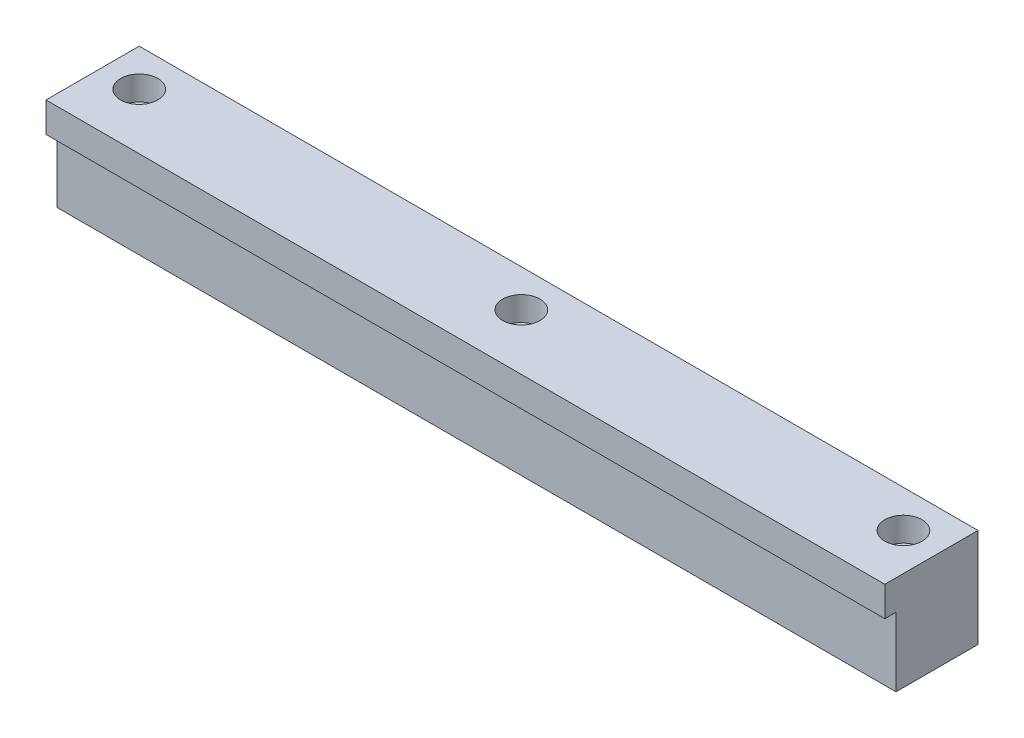
ISO-10303-21;
HEADER;
FILE_DESCRIPTION(('STEP AP214'),'2;1');
FILE_NAME('part.step','',(''),(''),'','','');
FILE_SCHEMA(('AUTOMOTIVE_DESIGN { 1 0 10303 214 1 1 1 1 }'));
ENDSEC;
DATA;
#1=APPLICATION_CONTEXT('core data for automotive mechanical design processes');
#2=APPLICATION_PROTOCOL_DEFINITION('international standard','automotive_design',2000,#1);
#3=PRODUCT_CONTEXT('',#1,'mechanical');
#4=PRODUCT('Part','Part','',(#3));
#5=PRODUCT_RELATED_PRODUCT_CATEGORY('part','',(#4));
#6=PRODUCT_DEFINITION_FORMATION('','',#4);
#7=PRODUCT_DEFINITION_CONTEXT('part definition',#1,'design');
#8=PRODUCT_DEFINITION('design','',#6,#7);
#9=PRODUCT_DEFINITION_SHAPE('','',#8);
#10=(LENGTH_UNIT() NAMED_UNIT(*) SI_UNIT(.MILLI.,.METRE.));
#11=(NAMED_UNIT(*) PLANE_ANGLE_UNIT() SI_UNIT($,.RADIAN.));
#12=(NAMED_UNIT(*) SI_UNIT($,.STERADIAN.) SOLID_ANGLE_UNIT());
#13=UNCERTAINTY_MEASURE_WITH_UNIT(LENGTH_MEASURE(1.E-05),#10,'distance_accuracy_value','');
#14=(GEOMETRIC_REPRESENTATION_CONTEXT(3) GLOBAL_UNCERTAINTY_ASSIGNED_CONTEXT((#13)) GLOBAL_UNIT_ASSIGNED_CONTEXT((#10,
#11,#12)) REPRESENTATION_CONTEXT('',''));
#15=CARTESIAN_POINT('',(0.,0.,0.));
#16=DIRECTION('',(0.,0.,1.));
#17=DIRECTION('',(1.,0.,0.));
#18=AXIS2_PLACEMENT_3D('',#15,#16,#17);
#19=CARTESIAN_POINT('',(205.,-1.2E-05,-5.));
#20=DIRECTION('',(0.,1.,0.));
#21=DIRECTION('',(0.,0.,1.));
#22=AXIS2_PLACEMENT_3D('',#19,#20,#21);
#23=CYLINDRICAL_SURFACE('',#22,7.00000000000001);
#24=CARTESIAN_POINT('',(205.,0.,-5.));
#25=DIRECTION('',(0.,1.,0.));
#26=DIRECTION('',(0.,0.,1.));
#27=AXIS2_PLACEMENT_3D('',#24,#25,#26);
#28=CIRCLE('',#27,7.00000000000001);
#29=CARTESIAN_POINT('',(205.,0.,2.00000000000001));
#30=VERTEX_POINT('',#29);
#31=EDGE_CURVE('E154',#30,#30,#28,.T.);
#32=CARTESIAN_POINT('',(205.,40.,-5.));
#33=DIRECTION('',(0.,1.,0.));
#34=DIRECTION('',(0.,0.,1.));
#35=AXIS2_PLACEMENT_3D('',#32,#33,#34);
#36=CIRCLE('',#35,7.00000000000001);
#37=CARTESIAN_POINT('',(205.,40.,2.00000000000001));
#38=VERTEX_POINT('',#37);
#39=EDGE_CURVE('E43',#38,#38,#36,.F.);
#40=CARTESIAN_POINT('',(205.,0.,2.00000000000001));
#41=CARTESIAN_POINT('',(205.,0.416666666666666,2.00000000000001));
#42=CARTESIAN_POINT('',(205.,0.833333333333333,2.00000000000001));
#43=CARTESIAN_POINT('',(205.,1.66666666666667,2.00000000000001));
#44=CARTESIAN_POINT('',(205.,2.08333333333333,2.00000000000001));
#45=CARTESIAN_POINT('',(205.,2.91666666666667,2.00000000000001));
#46=CARTESIAN_POINT('',(205.,3.33333333333333,2.00000000000001));
#47=CARTESIAN_POINT('',(205.,4.16666666666667,2.00000000000001));
#48=CARTESIAN_POINT('',(205.,4.58333333333333,2.00000000000001));
#49=CARTESIAN_POINT('',(205.,5.41666666666667,2.00000000000001));
#50=CARTESIAN_POINT('',(205.,5.83333333333333,2.00000000000001));
#51=CARTESIAN_POINT('',(205.,6.66666666666667,2.00000000000001));
#52=CARTESIAN_POINT('',(205.,7.08333333333333,2.00000000000001));
#53=CARTESIAN_POINT('',(205.,7.91666666666667,2.00000000000001));
#54=CARTESIAN_POINT('',(205.,8.33333333333333,2.00000000000001));
#55=CARTESIAN_POINT('',(205.,9.16666666666666,2.00000000000001));
#56=CARTESIAN_POINT('',(205.,9.58333333333333,2.00000000000001));
#57=CARTESIAN_POINT('',(205.,10.4166666666667,2.00000000000001));
#58=CARTESIAN_POINT('',(205.,10.8333333333333,2.00000000000001));
#59=CARTESIAN_POINT('',(205.,11.6666666666667,2.00000000000001));
#60=CARTESIAN_POINT('',(205.,12.0833333333333,2.00000000000001));
#61=CARTESIAN_POINT('',(205.,12.9166666666667,2.00000000000001));
#62=CARTESIAN_POINT('',(205.,13.3333333333333,2.00000000000001));
#63=CARTESIAN_POINT('',(205.,14.1666666666667,2.00000000000001));
#64=CARTESIAN_POINT('',(205.,14.5833333333333,2.00000000000001));
#65=CARTESIAN_POINT('',(205.,15.4166666666667,2.00000000000001));
#66=CARTESIAN_POINT('',(205.,15.8333333333333,2.00000000000001));
#67=CARTESIAN_POINT('',(205.,16.6666666666667,2.00000000000001));
#68=CARTESIAN_POINT('',(205.,17.0833333333333,2.00000000000001));
#69=CARTESIAN_POINT('',(205.,17.9166666666667,2.00000000000001));
#70=CARTESIAN_POINT('',(205.,18.3333333333333,2.00000000000001));
#71=CARTESIAN_POINT('',(205.,19.1666666666667,2.00000000000001));
#72=CARTESIAN_POINT('',(205.,19.5833333333333,2.00000000000001));
#73=CARTESIAN_POINT('',(205.,20.4166666666667,2.00000000000001));
#74=CARTESIAN_POINT('',(205.,20.8333333333333,2.00000000000001));
#75=CARTESIAN_POINT('',(205.,21.6666666666667,2.00000000000001));
#76=CARTESIAN_POINT('',(205.,22.0833333333333,2.00000000000001));
#77=CARTESIAN_POINT('',(205.,22.9166666666667,2.00000000000001));
#78=CARTESIAN_POINT('',(205.,23.3333333333333,2.00000000000001));
#79=CARTESIAN_POINT('',(205.,24.1666666666667,2.00000000000001));
#80=CARTESIAN_POINT('',(205.,24.5833333333333,2.00000000000001));
#81=CARTESIAN_POINT('',(205.,25.4166666666667,2.00000000000001));
#82=CARTESIAN_POINT('',(205.,25.8333333333333,2.00000000000001));
#83=CARTESIAN_POINT('',(205.,26.6666666666667,2.00000000000001));
#84=CARTESIAN_POINT('',(205.,27.0833333333333,2.00000000000001));
#85=CARTESIAN_POINT('',(205.,27.9166666666667,2.00000000000001));
#86=CARTESIAN_POINT('',(205.,28.3333333333333,2.00000000000001));
#87=CARTESIAN_POINT('',(205.,29.1666666666667,2.00000000000001));
#88=CARTESIAN_POINT('',(205.,29.5833333333333,2.00000000000001));
#89=CARTESIAN_POINT('',(205.,30.4166666666667,2.00000000000001));
#90=CARTESIAN_POINT('',(205.,30.8333333333333,2.00000000000001));
#91=CARTESIAN_POINT('',(205.,31.6666666666667,2.00000000000001));
#92=CARTESIAN_POINT('',(205.,32.0833333333333,2.00000000000001));
#93=CARTESIAN_POINT('',(205.,32.9166666666667,2.00000000000001));
#94=CARTESIAN_POINT('',(205.,33.3333333333333,2.00000000000001));
#95=CARTESIAN_POINT('',(205.,34.1666666666667,2.00000000000001));
#96=CARTESIAN_POINT('',(205.,34.5833333333333,2.00000000000001));
#97=CARTESIAN_POINT('',(205.,35.4166666666667,2.00000000000001));
#98=CARTESIAN_POINT('',(205.,35.8333333333333,2.00000000000001));
#99=CARTESIAN_POINT('',(205.,36.6666666666667,2.00000000000001));
#100=CARTESIAN_POINT('',(205.,37.0833333333333,2.00000000000001));
#101=CARTESIAN_POINT('',(205.,37.9166666666667,2.00000000000001));
#102=CARTESIAN_POINT('',(205.,38.3333333333333,2.00000000000001));
#103=CARTESIAN_POINT('',(205.,39.1666666666667,2.00000000000001));
#104=CARTESIAN_POINT('',(205.,39.5833333333333,2.00000000000001));
#105=CARTESIAN_POINT('',(205.,40.,2.00000000000001));
#106=B_SPLINE_CURVE_WITH_KNOTS('',3,(#40,#41,#42,#43,#44,#45,#46,#47,#48,#49,#50,#51,#52,#53,
#54,#55,#56,#57,#58,#59,#60,#61,#62,#63,#64,#65,#66,#67,#68,#69,#70,#71,#72,#73,#74,#75,#76,#77,
#78,#79,#80,#81,#82,#83,#84,#85,#86,#87,#88,#89,#90,#91,#92,#93,#94,#95,#96,#97,#98,#99,#100,
#101,#102,#103,#104,#105),.UNSPECIFIED.,.F.,.F.,(4,2,2,2,2,2,2,2,2,2,2,2,2,2,2,2,2,2,2,2,2,2,2,
2,2,2,2,2,2,2,2,2,4),(0.,1.25,2.5,3.75,5.,6.25,7.5,8.75,10.,11.25,12.5,13.75,15.,16.25,17.5,
18.75,20.,21.25,22.5,23.75,25.,26.25,27.5,28.75,30.,31.25,32.5,33.75,35.,36.25,37.5,38.75,40.),.UNSPECIFIED.);
#107=EDGE_CURVE('BSEAM39',#30,#38,#106,.T.);
#108=ORIENTED_EDGE('',*,*,#31,.F.);
#109=ORIENTED_EDGE('',*,*,#39,.F.);
#110=ORIENTED_EDGE('',*,*,#107,.T.);
#111=ORIENTED_EDGE('',*,*,#107,.F.);
#112=EDGE_LOOP('',(#108,#110,#109,#111));
#113=FACE_BOUND('',#112,.T.);
#114=ADVANCED_FACE('F39',(#113),#23,.F.);
#115=CARTESIAN_POINT('',(0.,-1.2E-05,-5.));
#116=DIRECTION('',(0.,1.,0.));
#117=DIRECTION('',(0.,0.,1.));
#118=AXIS2_PLACEMENT_3D('',#115,#116,#117);
#119=CYLINDRICAL_SURFACE('',#118,7.);
#120=CARTESIAN_POINT('',(0.,0.,-5.));
#121=DIRECTION('',(0.,1.,0.));
#122=DIRECTION('',(0.,0.,1.));
#123=AXIS2_PLACEMENT_3D('',#120,#121,#122);
#124=CIRCLE('',#123,7.);
#125=CARTESIAN_POINT('',(0.,0.,2.));
#126=VERTEX_POINT('',#125);
#127=EDGE_CURVE('E116',#126,#126,#124,.T.);
#128=CARTESIAN_POINT('',(0.,40.,-5.));
#129=DIRECTION('',(0.,1.,0.));
#130=DIRECTION('',(0.,0.,1.));
#131=AXIS2_PLACEMENT_3D('',#128,#129,#130);
#132=CIRCLE('',#131,7.);
#133=CARTESIAN_POINT('',(0.,40.,2.));
#134=VERTEX_POINT('',#133);
#135=EDGE_CURVE('E148',#134,#134,#132,.F.);
#136=CARTESIAN_POINT('',(0.,0.,2.));
#137=CARTESIAN_POINT('',(0.,0.416666666666666,2.));
#138=CARTESIAN_POINT('',(0.,0.833333333333333,2.));
#139=CARTESIAN_POINT('',(0.,1.66666666666667,2.));
#140=CARTESIAN_POINT('',(0.,2.08333333333333,2.));
#141=CARTESIAN_POINT('',(0.,2.91666666666667,2.));
#142=CARTESIAN_POINT('',(0.,3.33333333333333,2.));
#143=CARTESIAN_POINT('',(0.,4.16666666666667,2.));
#144=CARTESIAN_POINT('',(0.,4.58333333333333,2.));
#145=CARTESIAN_POINT('',(0.,5.41666666666667,2.));
#146=CARTESIAN_POINT('',(0.,5.83333333333333,2.));
#147=CARTESIAN_POINT('',(0.,6.66666666666667,2.));
#148=CARTESIAN_POINT('',(0.,7.08333333333333,2.));
#149=CARTESIAN_POINT('',(0.,7.91666666666667,2.));
#150=CARTESIAN_POINT('',(0.,8.33333333333333,2.));
#151=CARTESIAN_POINT('',(0.,9.16666666666666,2.));
#152=CARTESIAN_POINT('',(0.,9.58333333333333,2.));
#153=CARTESIAN_POINT('',(0.,10.4166666666667,2.));
#154=CARTESIAN_POINT('',(0.,10.8333333333333,2.));
#155=CARTESIAN_POINT('',(0.,11.6666666666667,2.));
#156=CARTESIAN_POINT('',(0.,12.0833333333333,2.));
#157=CARTESIAN_POINT('',(0.,12.9166666666667,2.));
#158=CARTESIAN_POINT('',(0.,13.3333333333333,2.));
#159=CARTESIAN_POINT('',(0.,14.1666666666667,2.));
#160=CARTESIAN_POINT('',(0.,14.5833333333333,2.));
#161=CARTESIAN_POINT('',(0.,15.4166666666667,2.));
#162=CARTESIAN_POINT('',(0.,15.8333333333333,2.));
#163=CARTESIAN_POINT('',(0.,16.6666666666667,2.));
#164=CARTESIAN_POINT('',(0.,17.0833333333333,2.));
#165=CARTESIAN_POINT('',(0.,17.9166666666667,2.));
#166=CARTESIAN_POINT('',(0.,18.3333333333333,2.));
#167=CARTESIAN_POINT('',(0.,19.1666666666667,2.));
#168=CARTESIAN_POINT('',(0.,19.5833333333333,2.));
#169=CARTESIAN_POINT('',(0.,20.4166666666667,2.));
#170=CARTESIAN_POINT('',(0.,20.8333333333333,2.));
#171=CARTESIAN_POINT('',(0.,21.6666666666667,2.));
#172=CARTESIAN_POINT('',(0.,22.0833333333333,2.));
#173=CARTESIAN_POINT('',(0.,22.9166666666667,2.));
#174=CARTESIAN_POINT('',(0.,23.3333333333333,2.));
#175=CARTESIAN_POINT('',(0.,24.1666666666667,2.));
#176=CARTESIAN_POINT('',(0.,24.5833333333333,2.));
#177=CARTESIAN_POINT('',(0.,25.4166666666667,2.));
#178=CARTESIAN_POINT('',(0.,25.8333333333333,2.));
#179=CARTESIAN_POINT('',(0.,26.6666666666667,2.));
#180=CARTESIAN_POINT('',(0.,27.0833333333333,2.));
#181=CARTESIAN_POINT('',(0.,27.9166666666667,2.));
#182=CARTESIAN_POINT('',(0.,28.3333333333333,2.));
#183=CARTESIAN_POINT('',(0.,29.1666666666667,2.));
#184=CARTESIAN_POINT('',(0.,29.5833333333333,2.));
#185=CARTESIAN_POINT('',(0.,30.4166666666667,2.));
#186=CARTESIAN_POINT('',(0.,30.8333333333333,2.));
#187=CARTESIAN_POINT('',(0.,31.6666666666667,2.));
#188=CARTESIAN_POINT('',(0.,32.0833333333333,2.));
#189=CARTESIAN_POINT('',(0.,32.9166666666667,2.));
#190=CARTESIAN_POINT('',(0.,33.3333333333333,2.));
#191=CARTESIAN_POINT('',(0.,34.1666666666667,2.));
#192=CARTESIAN_POINT('',(0.,34.5833333333333,2.));
#193=CARTESIAN_POINT('',(0.,35.4166666666667,2.));
#194=CARTESIAN_POINT('',(0.,35.8333333333333,2.));
#195=CARTESIAN_POINT('',(0.,36.6666666666667,2.));
#196=CARTESIAN_POINT('',(0.,37.0833333333333,2.));
#197=CARTESIAN_POINT('',(0.,37.9166666666667,2.));
#198=CARTESIAN_POINT('',(0.,38.3333333333333,2.));
#199=CARTESIAN_POINT('',(0.,39.1666666666667,2.));
#200=CARTESIAN_POINT('',(0.,39.5833333333333,2.));
#201=CARTESIAN_POINT('',(0.,40.,2.));
#202=B_SPLINE_CURVE_WITH_KNOTS('',3,(#136,#137,#138,#139,#140,#141,#142,#143,#144,#145,#146,
#147,#148,#149,#150,#151,#152,#153,#154,#155,#156,#157,#158,#159,#160,#161,#162,#163,#164,#165,
#166,#167,#168,#169,#170,#171,#172,#173,#174,#175,#176,#177,#178,#179,#180,#181,#182,#183,#184,
#185,#186,#187,#188,#189,#190,#191,#192,#193,#194,#195,#196,#197,#198,#199,#200,#201),
.UNSPECIFIED.,.F.,.F.,(4,2,2,2,2,2,2,2,2,2,2,2,2,2,2,2,2,2,2,2,2,2,2,2,2,2,2,2,2,2,2,2,4),(0.,
1.25,2.5,3.75,5.,6.25,7.5,8.75,10.,11.25,12.5,13.75,15.,16.25,17.5,18.75,20.,21.25,22.5,23.75,
25.,26.25,27.5,28.75,30.,31.25,32.5,33.75,35.,36.25,37.5,38.75,40.),.UNSPECIFIED.);
#203=EDGE_CURVE('BSEAM205',#126,#134,#202,.T.);
#204=ORIENTED_EDGE('',*,*,#127,.F.);
#205=ORIENTED_EDGE('',*,*,#135,.F.);
#206=ORIENTED_EDGE('',*,*,#203,.T.);
#207=ORIENTED_EDGE('',*,*,#203,.F.);
#208=EDGE_LOOP('',(#204,#206,#205,#207));
#209=FACE_BOUND('',#208,.T.);
#210=ADVANCED_FACE('F205',(#209),#119,.F.);
#211=CARTESIAN_POINT('',(-205.,-1.2E-05,-5.));
#212=DIRECTION('',(0.,1.,0.));
#213=DIRECTION('',(0.,0.,1.));
#214=AXIS2_PLACEMENT_3D('',#211,#212,#213);
#215=CYLINDRICAL_SURFACE('',#214,7.00000000000001);
#216=CARTESIAN_POINT('',(-205.,0.,-5.));
#217=DIRECTION('',(0.,1.,0.));
#218=DIRECTION('',(0.,0.,1.));
#219=AXIS2_PLACEMENT_3D('',#216,#217,#218);
#220=CIRCLE('',#219,7.00000000000001);
#221=CARTESIAN_POINT('',(-205.,0.,2.00000000000001));
#222=VERTEX_POINT('',#221);
#223=EDGE_CURVE('E113',#222,#222,#220,.T.);
#224=CARTESIAN_POINT('',(-205.,40.,-5.));
#225=DIRECTION('',(0.,1.,0.));
#226=DIRECTION('',(0.,0.,1.));
#227=AXIS2_PLACEMENT_3D('',#224,#225,#226);
#228=CIRCLE('',#227,7.00000000000001);
#229=CARTESIAN_POINT('',(-205.,40.,2.00000000000001));
#230=VERTEX_POINT('',#229);
#231=EDGE_CURVE('E146',#230,#230,#228,.F.);
#232=CARTESIAN_POINT('',(-205.,0.,2.00000000000001));
#233=CARTESIAN_POINT('',(-205.,0.416666666666666,2.00000000000001));
#234=CARTESIAN_POINT('',(-205.,0.833333333333333,2.00000000000001));
#235=CARTESIAN_POINT('',(-205.,1.66666666666667,2.00000000000001));
#236=CARTESIAN_POINT('',(-205.,2.08333333333333,2.00000000000001));
#237=CARTESIAN_POINT('',(-205.,2.91666666666667,2.00000000000001));
#238=CARTESIAN_POINT('',(-205.,3.33333333333333,2.00000000000001));
#239=CARTESIAN_POINT('',(-205.,4.16666666666667,2.00000000000001));
#240=CARTESIAN_POINT('',(-205.,4.58333333333333,2.00000000000001));
#241=CARTESIAN_POINT('',(-205.,5.41666666666667,2.00000000000001));
#242=CARTESIAN_POINT('',(-205.,5.83333333333333,2.00000000000001));
#243=CARTESIAN_POINT('',(-205.,6.66666666666667,2.00000000000001));
#244=CARTESIAN_POINT('',(-205.,7.08333333333333,2.00000000000001));
#245=CARTESIAN_POINT('',(-205.,7.91666666666667,2.00000000000001));
#246=CARTESIAN_POINT('',(-205.,8.33333333333333,2.00000000000001));
#247=CARTESIAN_POINT('',(-205.,9.16666666666666,2.00000000000001));
#248=CARTESIAN_POINT('',(-205.,9.58333333333333,2.00000000000001));
#249=CARTESIAN_POINT('',(-205.,10.4166666666667,2.00000000000001));
#250=CARTESIAN_POINT('',(-205.,10.8333333333333,2.00000000000001));
#251=CARTESIAN_POINT('',(-205.,11.6666666666667,2.00000000000001));
#252=CARTESIAN_POINT('',(-205.,12.0833333333333,2.00000000000001));
#253=CARTESIAN_POINT('',(-205.,12.9166666666667,2.00000000000001));
#254=CARTESIAN_POINT('',(-205.,13.3333333333333,2.00000000000001));
#255=CARTESIAN_POINT('',(-205.,14.1666666666667,2.00000000000001));
#256=CARTESIAN_POINT('',(-205.,14.5833333333333,2.00000000000001));
#257=CARTESIAN_POINT('',(-205.,15.4166666666667,2.00000000000001));
#258=CARTESIAN_POINT('',(-205.,15.8333333333333,2.00000000000001));
#259=CARTESIAN_POINT('',(-205.,16.6666666666667,2.00000000000001));
#260=CARTESIAN_POINT('',(-205.,17.0833333333333,2.00000000000001));
#261=CARTESIAN_POINT('',(-205.,17.9166666666667,2.00000000000001));
#262=CARTESIAN_POINT('',(-205.,18.3333333333333,2.00000000000001));
#263=CARTESIAN_POINT('',(-205.,19.1666666666667,2.00000000000001));
#264=CARTESIAN_POINT('',(-205.,19.5833333333333,2.00000000000001));
#265=CARTESIAN_POINT('',(-205.,20.4166666666667,2.00000000000001));
#266=CARTESIAN_POINT('',(-205.,20.8333333333333,2.00000000000001));
#267=CARTESIAN_POINT('',(-205.,21.6666666666667,2.00000000000001));
#268=CARTESIAN_POINT('',(-205.,22.0833333333333,2.00000000000001));
#269=CARTESIAN_POINT('',(-205.,22.9166666666667,2.00000000000001));
#270=CARTESIAN_POINT('',(-205.,23.3333333333333,2.00000000000001));
#271=CARTESIAN_POINT('',(-205.,24.1666666666667,2.00000000000001));
#272=CARTESIAN_POINT('',(-205.,24.5833333333333,2.00000000000001));
#273=CARTESIAN_POINT('',(-205.,25.4166666666667,2.00000000000001));
#274=CARTESIAN_POINT('',(-205.,25.8333333333333,2.00000000000001));
#275=CARTESIAN_POINT('',(-205.,26.6666666666667,2.00000000000001));
#276=CARTESIAN_POINT('',(-205.,27.0833333333333,2.00000000000001));
#277=CARTESIAN_POINT('',(-205.,27.9166666666667,2.00000000000001));
#278=CARTESIAN_POINT('',(-205.,28.3333333333333,2.00000000000001));
#279=CARTESIAN_POINT('',(-205.,29.1666666666667,2.00000000000001));
#280=CARTESIAN_POINT('',(-205.,29.5833333333333,2.00000000000001));
#281=CARTESIAN_POINT('',(-205.,30.4166666666667,2.00000000000001));
#282=CARTESIAN_POINT('',(-205.,30.8333333333333,2.00000000000001));
#283=CARTESIAN_POINT('',(-205.,31.6666666666667,2.00000000000001));
#284=CARTESIAN_POINT('',(-205.,32.0833333333333,2.00000000000001));
#285=CARTESIAN_POINT('',(-205.,32.9166666666667,2.00000000000001));
#286=CARTESIAN_POINT('',(-205.,33.3333333333333,2.00000000000001));
#287=CARTESIAN_POINT('',(-205.,34.1666666666667,2.00000000000001));
#288=CARTESIAN_POINT('',(-205.,34.5833333333333,2.00000000000001));
#289=CARTESIAN_POINT('',(-205.,35.4166666666667,2.00000000000001));
#290=CARTESIAN_POINT('',(-205.,35.8333333333333,2.00000000000001));
#291=CARTESIAN_POINT('',(-205.,36.6666666666667,2.00000000000001));
#292=CARTESIAN_POINT('',(-205.,37.0833333333333,2.00000000000001));
#293=CARTESIAN_POINT('',(-205.,37.9166666666667,2.00000000000001));
#294=CARTESIAN_POINT('',(-205.,38.3333333333333,2.00000000000001));
#295=CARTESIAN_POINT('',(-205.,39.1666666666667,2.00000000000001));
#296=CARTESIAN_POINT('',(-205.,39.5833333333333,2.00000000000001));
#297=CARTESIAN_POINT('',(-205.,40.,2.00000000000001));
#298=B_SPLINE_CURVE_WITH_KNOTS('',3,(#232,#233,#234,#235,#236,#237,#238,#239,#240,#241,#242,
#243,#244,#245,#246,#247,#248,#249,#250,#251,#252,#253,#254,#255,#256,#257,#258,#259,#260,#261,
#262,#263,#264,#265,#266,#267,#268,#269,#270,#271,#272,#273,#274,#275,#276,#277,#278,#279,#280,
#281,#282,#283,#284,#285,#286,#287,#288,#289,#290,#291,#292,#293,#294,#295,#296,#297),
.UNSPECIFIED.,.F.,.F.,(4,2,2,2,2,2,2,2,2,2,2,2,2,2,2,2,2,2,2,2,2,2,2,2,2,2,2,2,2,2,2,2,4),(0.,
1.25,2.5,3.75,5.,6.25,7.5,8.75,10.,11.25,12.5,13.75,15.,16.25,17.5,18.75,20.,21.25,22.5,23.75,
25.,26.25,27.5,28.75,30.,31.25,32.5,33.75,35.,36.25,37.5,38.75,40.),.UNSPECIFIED.);
#299=EDGE_CURVE('BSEAM211',#222,#230,#298,.T.);
#300=ORIENTED_EDGE('',*,*,#223,.F.);
#301=ORIENTED_EDGE('',*,*,#231,.F.);
#302=ORIENTED_EDGE('',*,*,#299,.T.);
#303=ORIENTED_EDGE('',*,*,#299,.F.);
#304=EDGE_LOOP('',(#300,#302,#301,#303));
#305=FACE_BOUND('',#304,.T.);
#306=ADVANCED_FACE('F211',(#305),#215,.F.);
#307=CARTESIAN_POINT('',(225.,37.,19.));
#308=DIRECTION('',(0.,0.,-1.));
#309=DIRECTION('',(-1.,0.,0.));
#310=AXIS2_PLACEMENT_3D('',#307,#308,#309);
#311=PLANE('',#310);
#312=DIRECTION('',(-1.,0.,0.));
#313=VECTOR('',#312,1.);
#314=CARTESIAN_POINT('',(225.,37.,19.));
#315=LINE('',#314,#313);
#316=CARTESIAN_POINT('',(225.,37.,19.));
#317=VERTEX_POINT('',#316);
#318=CARTESIAN_POINT('',(-225.,37.,19.));
#319=VERTEX_POINT('',#318);
#320=EDGE_CURVE('E112',#317,#319,#315,.T.);
#321=ORIENTED_EDGE('',*,*,#320,.T.);
#322=DIRECTION('',(0.,-1.,0.));
#323=VECTOR('',#322,1.);
#324=CARTESIAN_POINT('',(-225.,37.,19.));
#325=LINE('',#324,#323);
#326=CARTESIAN_POINT('',(-225.,0.,19.));
#327=VERTEX_POINT('',#326);
#328=EDGE_CURVE('E106',#319,#327,#325,.T.);
#329=ORIENTED_EDGE('',*,*,#328,.T.);
#330=DIRECTION('',(-1.,0.,0.));
#331=VECTOR('',#330,1.);
#332=CARTESIAN_POINT('',(225.,0.,19.));
#333=LINE('',#332,#331);
#334=CARTESIAN_POINT('',(225.,0.,19.));
#335=VERTEX_POINT('',#334);
#336=EDGE_CURVE('E11',#335,#327,#333,.T.);
#337=ORIENTED_EDGE('',*,*,#336,.F.);
#338=DIRECTION('',(0.,-1.,0.));
#339=VECTOR('',#338,1.);
#340=CARTESIAN_POINT('',(225.,37.,19.));
#341=LINE('',#340,#339);
#342=EDGE_CURVE('E129',#317,#335,#341,.T.);
#343=ORIENTED_EDGE('',*,*,#342,.F.);
#344=EDGE_LOOP('',(#321,#329,#337,#343));
#345=FACE_BOUND('',#344,.T.);
#346=ADVANCED_FACE('F41',(#345),#311,.F.);
#347=CARTESIAN_POINT('',(225.,0.,19.));
#348=DIRECTION('',(0.,1.,0.));
#349=DIRECTION('',(0.,0.,1.));
#350=AXIS2_PLACEMENT_3D('',#347,#348,#349);
#351=PLANE('',#350);
#352=CARTESIAN_POINT('',(-185.,0.,-5.));
#353=DIRECTION('',(0.,1.,0.));
#354=DIRECTION('',(0.,0.,1.));
#355=AXIS2_PLACEMENT_3D('',#352,#353,#354);
#356=CIRCLE('',#355,6.00000000000001);
#357=CARTESIAN_POINT('',(-185.,0.,1.00000000000001));
#358=VERTEX_POINT('',#357);
#359=EDGE_CURVE('E187',#358,#358,#356,.T.);
#360=ORIENTED_EDGE('',*,*,#359,.T.);
#361=EDGE_LOOP('',(#360));
#362=FACE_BOUND('',#361,.T.);
#363=CARTESIAN_POINT('',(185.,0.,-5.));
#364=DIRECTION('',(0.,1.,0.));
#365=DIRECTION('',(0.,0.,1.));
#366=AXIS2_PLACEMENT_3D('',#363,#364,#365);
#367=CIRCLE('',#366,6.00000000000001);
#368=CARTESIAN_POINT('',(185.,0.,1.00000000000001));
#369=VERTEX_POINT('',#368);
#370=EDGE_CURVE('E184',#369,#369,#367,.T.);
#371=ORIENTED_EDGE('',*,*,#370,.T.);
#372=EDGE_LOOP('',(#371));
#373=FACE_BOUND('',#372,.T.);
#374=ORIENTED_EDGE('',*,*,#223,.T.);
#375=EDGE_LOOP('',(#374));
#376=FACE_BOUND('',#375,.T.);
#377=ORIENTED_EDGE('',*,*,#127,.T.);
#378=EDGE_LOOP('',(#377));
#379=FACE_BOUND('',#378,.T.);
#380=ORIENTED_EDGE('',*,*,#31,.T.);
#381=EDGE_LOOP('',(#380));
#382=FACE_BOUND('',#381,.T.);
#383=ORIENTED_EDGE('',*,*,#336,.T.);
#384=DIRECTION('',(0.,0.,-1.));
#385=VECTOR('',#384,1.);
#386=CARTESIAN_POINT('',(-225.,0.,19.));
#387=LINE('',#386,#385);
#388=CARTESIAN_POINT('',(-225.,0.,-25.));
#389=VERTEX_POINT('',#388);
#390=EDGE_CURVE('E96',#327,#389,#387,.T.);
#391=ORIENTED_EDGE('',*,*,#390,.T.);
#392=DIRECTION('',(-1.,0.,0.));
#393=VECTOR('',#392,1.);
#394=CARTESIAN_POINT('',(225.,0.,-25.));
#395=LINE('',#394,#393);
#396=CARTESIAN_POINT('',(225.,0.,-25.));
#397=VERTEX_POINT('',#396);
#398=EDGE_CURVE('E48',#397,#389,#395,.T.);
#399=ORIENTED_EDGE('',*,*,#398,.F.);
#400=DIRECTION('',(0.,0.,-1.));
#401=VECTOR('',#400,1.);
#402=CARTESIAN_POINT('',(225.,0.,19.));
#403=LINE('',#402,#401);
#404=EDGE_CURVE('E97',#335,#397,#403,.T.);
#405=ORIENTED_EDGE('',*,*,#404,.F.);
#406=EDGE_LOOP('',(#383,#391,#399,#405));
#407=FACE_BOUND('',#406,.T.);
#408=ADVANCED_FACE('F94',(#362,#373,#376,#379,#382,#407),#351,.F.);
#409=CARTESIAN_POINT('',(225.,0.,-25.));
#410=DIRECTION('',(0.,0.,1.));
#411=DIRECTION('',(1.,0.,0.));
#412=AXIS2_PLACEMENT_3D('',#409,#410,#411);
#413=PLANE('',#412);
#414=ORIENTED_EDGE('',*,*,#398,.T.);
#415=DIRECTION('',(0.,1.,0.));
#416=VECTOR('',#415,1.);
#417=CARTESIAN_POINT('',(-225.,0.,-25.));
#418=LINE('',#417,#416);
#419=CARTESIAN_POINT('',(-225.,53.,-25.));
#420=VERTEX_POINT('',#419);
#421=EDGE_CURVE('E110',#389,#420,#418,.T.);
#422=ORIENTED_EDGE('',*,*,#421,.T.);
#423=DIRECTION('',(-1.,0.,0.));
#424=VECTOR('',#423,1.);
#425=CARTESIAN_POINT('',(225.,53.,-25.));
#426=LINE('',#425,#424);
#427=CARTESIAN_POINT('',(225.,53.,-25.));
#428=VERTEX_POINT('',#427);
#429=EDGE_CURVE('E143',#428,#420,#426,.T.);
#430=ORIENTED_EDGE('',*,*,#429,.F.);
#431=DIRECTION('',(0.,1.,0.));
#432=VECTOR('',#431,1.);
#433=CARTESIAN_POINT('',(225.,0.,-25.));
#434=LINE('',#433,#432);
#435=EDGE_CURVE('E132',#397,#428,#434,.T.);
#436=ORIENTED_EDGE('',*,*,#435,.F.);
#437=EDGE_LOOP('',(#414,#422,#430,#436));
#438=FACE_BOUND('',#437,.T.);
#439=ADVANCED_FACE('F234',(#438),#413,.F.);
#440=CARTESIAN_POINT('',(225.,53.,-25.));
#441=DIRECTION('',(0.,-1.,0.));
#442=DIRECTION('',(0.,0.,-1.));
#443=AXIS2_PLACEMENT_3D('',#440,#441,#442);
#444=PLANE('',#443);
#445=CARTESIAN_POINT('',(-205.,53.,-5.));
#446=DIRECTION('',(0.,1.,0.));
#447=DIRECTION('',(0.,0.,1.));
#448=AXIS2_PLACEMENT_3D('',#445,#446,#447);
#449=CIRCLE('',#448,10.);
#450=CARTESIAN_POINT('',(-205.,53.,5.00000000000001));
#451=VERTEX_POINT('',#450);
#452=EDGE_CURVE('E176',#451,#451,#449,.T.);
#453=ORIENTED_EDGE('',*,*,#452,.F.);
#454=EDGE_LOOP('',(#453));
#455=FACE_BOUND('',#454,.T.);
#456=CARTESIAN_POINT('',(0.,53.,-5.));
#457=DIRECTION('',(0.,1.,0.));
#458=DIRECTION('',(0.,0.,1.));
#459=AXIS2_PLACEMENT_3D('',#456,#457,#458);
#460=CIRCLE('',#459,10.);
#461=CARTESIAN_POINT('',(0.,53.,5.));
#462=VERTEX_POINT('',#461);
#463=EDGE_CURVE('E173',#462,#462,#460,.T.);
#464=ORIENTED_EDGE('',*,*,#463,.F.);
#465=EDGE_LOOP('',(#464));
#466=FACE_BOUND('',#465,.T.);
#467=CARTESIAN_POINT('',(205.,53.,-5.));
#468=DIRECTION('',(0.,1.,0.));
#469=DIRECTION('',(0.,0.,1.));
#470=AXIS2_PLACEMENT_3D('',#467,#468,#469);
#471=CIRCLE('',#470,10.);
#472=CARTESIAN_POINT('',(205.,53.,5.00000000000001));
#473=VERTEX_POINT('',#472);
#474=EDGE_CURVE('E166',#473,#473,#471,.T.);
#475=ORIENTED_EDGE('',*,*,#474,.F.);
#476=EDGE_LOOP('',(#475));
#477=FACE_BOUND('',#476,.T.);
#478=ORIENTED_EDGE('',*,*,#429,.T.);
#479=DIRECTION('',(0.,0.,1.));
#480=VECTOR('',#479,1.);
#481=CARTESIAN_POINT('',(-225.,53.,-25.));
#482=LINE('',#481,#480);
#483=CARTESIAN_POINT('',(-225.,53.,25.));
#484=VERTEX_POINT('',#483);
#485=EDGE_CURVE('E121',#420,#484,#482,.T.);
#486=ORIENTED_EDGE('',*,*,#485,.T.);
#487=DIRECTION('',(-1.,0.,0.));
#488=VECTOR('',#487,1.);
#489=CARTESIAN_POINT('',(225.,53.,25.));
#490=LINE('',#489,#488);
#491=CARTESIAN_POINT('',(225.,53.,25.));
#492=VERTEX_POINT('',#491);
#493=EDGE_CURVE('E141',#492,#484,#490,.T.);
#494=ORIENTED_EDGE('',*,*,#493,.F.);
#495=DIRECTION('',(0.,0.,1.));
#496=VECTOR('',#495,1.);
#497=CARTESIAN_POINT('',(225.,53.,-25.));
#498=LINE('',#497,#496);
#499=EDGE_CURVE('E134',#428,#492,#498,.T.);
#500=ORIENTED_EDGE('',*,*,#499,.F.);
#501=EDGE_LOOP('',(#478,#486,#494,#500));
#502=FACE_BOUND('',#501,.T.);
#503=ADVANCED_FACE('F230',(#455,#466,#477,#502),#444,.F.);
#504=CARTESIAN_POINT('',(225.,53.,25.));
#505=DIRECTION('',(0.,0.,-1.));
#506=DIRECTION('',(-1.,0.,0.));
#507=AXIS2_PLACEMENT_3D('',#504,#505,#506);
#508=PLANE('',#507);
#509=ORIENTED_EDGE('',*,*,#493,.T.);
#510=DIRECTION('',(0.,-1.,0.));
#511=VECTOR('',#510,1.);
#512=CARTESIAN_POINT('',(-225.,53.,25.));
#513=LINE('',#512,#511);
#514=CARTESIAN_POINT('',(-225.,37.,25.));
#515=VERTEX_POINT('',#514);
#516=EDGE_CURVE('E124',#484,#515,#513,.T.);
#517=ORIENTED_EDGE('',*,*,#516,.T.);
#518=DIRECTION('',(-1.,0.,0.));
#519=VECTOR('',#518,1.);
#520=CARTESIAN_POINT('',(225.,37.,25.));
#521=LINE('',#520,#519);
#522=CARTESIAN_POINT('',(225.,37.,25.));
#523=VERTEX_POINT('',#522);
#524=EDGE_CURVE('E139',#523,#515,#521,.T.);
#525=ORIENTED_EDGE('',*,*,#524,.F.);
#526=DIRECTION('',(0.,-1.,0.));
#527=VECTOR('',#526,1.);
#528=CARTESIAN_POINT('',(225.,53.,25.));
#529=LINE('',#528,#527);
#530=EDGE_CURVE('E61',#492,#523,#529,.T.);
#531=ORIENTED_EDGE('',*,*,#530,.F.);
#532=EDGE_LOOP('',(#509,#517,#525,#531));
#533=FACE_BOUND('',#532,.T.);
#534=ADVANCED_FACE('F226',(#533),#508,.F.);
#535=CARTESIAN_POINT('',(225.,37.,25.));
#536=DIRECTION('',(0.,1.,0.));
#537=DIRECTION('',(0.,0.,1.));
#538=AXIS2_PLACEMENT_3D('',#535,#536,#537);
#539=PLANE('',#538);
#540=ORIENTED_EDGE('',*,*,#524,.T.);
#541=DIRECTION('',(0.,0.,-1.));
#542=VECTOR('',#541,1.);
#543=CARTESIAN_POINT('',(-225.,37.,25.));
#544=LINE('',#543,#542);
#545=EDGE_CURVE('E127',#515,#319,#544,.T.);
#546=ORIENTED_EDGE('',*,*,#545,.T.);
#547=ORIENTED_EDGE('',*,*,#320,.F.);
#548=DIRECTION('',(0.,0.,-1.));
#549=VECTOR('',#548,1.);
#550=CARTESIAN_POINT('',(225.,37.,25.));
#551=LINE('',#550,#549);
#552=EDGE_CURVE('E56',#523,#317,#551,.T.);
#553=ORIENTED_EDGE('',*,*,#552,.F.);
#554=EDGE_LOOP('',(#540,#546,#547,#553));
#555=FACE_BOUND('',#554,.T.);
#556=ADVANCED_FACE('F223',(#555),#539,.F.);
#557=CARTESIAN_POINT('',(225.,0.,0.));
#558=DIRECTION('',(1.,0.,0.));
#559=DIRECTION('',(0.,0.,-1.));
#560=AXIS2_PLACEMENT_3D('',#557,#558,#559);
#561=PLANE('',#560);
#562=ORIENTED_EDGE('',*,*,#342,.T.);
#563=ORIENTED_EDGE('',*,*,#404,.T.);
#564=ORIENTED_EDGE('',*,*,#435,.T.);
#565=ORIENTED_EDGE('',*,*,#499,.T.);
#566=ORIENTED_EDGE('',*,*,#530,.T.);
#567=ORIENTED_EDGE('',*,*,#552,.T.);
#568=EDGE_LOOP('',(#562,#563,#564,#565,#566,#567));
#569=FACE_BOUND('',#568,.T.);
#570=ADVANCED_FACE('F220',(#569),#561,.T.);
#571=CARTESIAN_POINT('',(-225.,0.,0.));
#572=DIRECTION('',(1.,0.,0.));
#573=DIRECTION('',(0.,0.,-1.));
#574=AXIS2_PLACEMENT_3D('',#571,#572,#573);
#575=PLANE('',#574);
#576=ORIENTED_EDGE('',*,*,#328,.F.);
#577=ORIENTED_EDGE('',*,*,#545,.F.);
#578=ORIENTED_EDGE('',*,*,#516,.F.);
#579=ORIENTED_EDGE('',*,*,#485,.F.);
#580=ORIENTED_EDGE('',*,*,#421,.F.);
#581=ORIENTED_EDGE('',*,*,#390,.F.);
#582=EDGE_LOOP('',(#576,#577,#578,#579,#580,#581));
#583=FACE_BOUND('',#582,.T.);
#584=ADVANCED_FACE('F104',(#583),#575,.F.);
#585=CARTESIAN_POINT('',(-205.,40.,-5.));
#586=DIRECTION('',(0.,1.,0.));
#587=DIRECTION('',(0.,0.,1.));
#588=AXIS2_PLACEMENT_3D('',#585,#586,#587);
#589=PLANE('',#588);
#590=CARTESIAN_POINT('',(-205.,40.,-5.));
#591=DIRECTION('',(0.,1.,0.));
#592=DIRECTION('',(0.,0.,1.));
#593=AXIS2_PLACEMENT_3D('',#590,#591,#592);
#594=CIRCLE('',#593,10.);
#595=CARTESIAN_POINT('',(-205.,40.,5.00000000000001));
#596=VERTEX_POINT('',#595);
#597=EDGE_CURVE('E149',#596,#596,#594,.T.);
#598=ORIENTED_EDGE('',*,*,#597,.T.);
#599=EDGE_LOOP('',(#598));
#600=FACE_BOUND('',#599,.T.);
#601=ORIENTED_EDGE('',*,*,#231,.T.);
#602=EDGE_LOOP('',(#601));
#603=FACE_BOUND('',#602,.T.);
#604=ADVANCED_FACE('F219',(#600,#603),#589,.T.);
#605=CARTESIAN_POINT('',(-205.,40.,-5.));
#606=DIRECTION('',(0.,1.,0.));
#607=DIRECTION('',(0.,0.,1.));
#608=AXIS2_PLACEMENT_3D('',#605,#606,#607);
#609=CYLINDRICAL_SURFACE('',#608,10.);
#610=ORIENTED_EDGE('',*,*,#597,.F.);
#611=EDGE_LOOP('',(#610));
#612=FACE_BOUND('',#611,.T.);
#613=ORIENTED_EDGE('',*,*,#452,.T.);
#614=EDGE_LOOP('',(#613));
#615=FACE_BOUND('',#614,.T.);
#616=ADVANCED_FACE('F257',(#612,#615),#609,.F.);
#617=CARTESIAN_POINT('',(0.,40.,-5.));
#618=DIRECTION('',(0.,1.,0.));
#619=DIRECTION('',(0.,0.,1.));
#620=AXIS2_PLACEMENT_3D('',#617,#618,#619);
#621=PLANE('',#620);
#622=CARTESIAN_POINT('',(0.,40.,-5.));
#623=DIRECTION('',(0.,1.,0.));
#624=DIRECTION('',(0.,0.,1.));
#625=AXIS2_PLACEMENT_3D('',#622,#623,#624);
#626=CIRCLE('',#625,10.);
#627=CARTESIAN_POINT('',(0.,40.,5.));
#628=VERTEX_POINT('',#627);
#629=EDGE_CURVE('E170',#628,#628,#626,.T.);
#630=ORIENTED_EDGE('',*,*,#629,.T.);
#631=EDGE_LOOP('',(#630));
#632=FACE_BOUND('',#631,.T.);
#633=ORIENTED_EDGE('',*,*,#135,.T.);
#634=EDGE_LOOP('',(#633));
#635=FACE_BOUND('',#634,.T.);
#636=ADVANCED_FACE('F263',(#632,#635),#621,.T.);
#637=CARTESIAN_POINT('',(0.,40.,-5.));
#638=DIRECTION('',(0.,1.,0.));
#639=DIRECTION('',(0.,0.,1.));
#640=AXIS2_PLACEMENT_3D('',#637,#638,#639);
#641=CYLINDRICAL_SURFACE('',#640,10.);
#642=ORIENTED_EDGE('',*,*,#629,.F.);
#643=EDGE_LOOP('',(#642));
#644=FACE_BOUND('',#643,.T.);
#645=ORIENTED_EDGE('',*,*,#463,.T.);
#646=EDGE_LOOP('',(#645));
#647=FACE_BOUND('',#646,.T.);
#648=ADVANCED_FACE('F269',(#644,#647),#641,.F.);
#649=CARTESIAN_POINT('',(205.,40.,-5.));
#650=DIRECTION('',(0.,1.,0.));
#651=DIRECTION('',(0.,0.,1.));
#652=AXIS2_PLACEMENT_3D('',#649,#650,#651);
#653=PLANE('',#652);
#654=CARTESIAN_POINT('',(205.,40.,-5.));
#655=DIRECTION('',(0.,1.,0.));
#656=DIRECTION('',(0.,0.,1.));
#657=AXIS2_PLACEMENT_3D('',#654,#655,#656);
#658=CIRCLE('',#657,10.);
#659=CARTESIAN_POINT('',(205.,40.,5.00000000000001));
#660=VERTEX_POINT('',#659);
#661=EDGE_CURVE('E163',#660,#660,#658,.T.);
#662=ORIENTED_EDGE('',*,*,#661,.T.);
#663=EDGE_LOOP('',(#662));
#664=FACE_BOUND('',#663,.T.);
#665=ORIENTED_EDGE('',*,*,#39,.T.);
#666=EDGE_LOOP('',(#665));
#667=FACE_BOUND('',#666,.T.);
#668=ADVANCED_FACE('F272',(#664,#667),#653,.T.);
#669=CARTESIAN_POINT('',(205.,40.,-5.));
#670=DIRECTION('',(0.,1.,0.));
#671=DIRECTION('',(0.,0.,1.));
#672=AXIS2_PLACEMENT_3D('',#669,#670,#671);
#673=CYLINDRICAL_SURFACE('',#672,10.);
#674=ORIENTED_EDGE('',*,*,#661,.F.);
#675=EDGE_LOOP('',(#674));
#676=FACE_BOUND('',#675,.T.);
#677=ORIENTED_EDGE('',*,*,#474,.T.);
#678=EDGE_LOOP('',(#677));
#679=FACE_BOUND('',#678,.T.);
#680=ADVANCED_FACE('F277',(#676,#679),#673,.F.);
#681=CARTESIAN_POINT('',(185.,15.,-5.));
#682=DIRECTION('',(0.,-1.,0.));
#683=DIRECTION('',(0.,0.,-1.));
#684=AXIS2_PLACEMENT_3D('',#681,#682,#683);
#685=CYLINDRICAL_SURFACE('',#684,6.00000000000001);
#686=CARTESIAN_POINT('',(185.,15.,-5.));
#687=DIRECTION('',(0.,1.,0.));
#688=DIRECTION('',(0.,0.,1.));
#689=AXIS2_PLACEMENT_3D('',#686,#687,#688);
#690=CIRCLE('',#689,6.00000000000001);
#691=CARTESIAN_POINT('',(185.,15.,1.00000000000001));
#692=VERTEX_POINT('',#691);
#693=EDGE_CURVE('E181',#692,#692,#690,.T.);
#694=ORIENTED_EDGE('',*,*,#693,.T.);
#695=EDGE_LOOP('',(#694));
#696=FACE_BOUND('',#695,.T.);
#697=ORIENTED_EDGE('',*,*,#370,.F.);
#698=EDGE_LOOP('',(#697));
#699=FACE_BOUND('',#698,.T.);
#700=ADVANCED_FACE('F280',(#696,#699),#685,.F.);
#701=CARTESIAN_POINT('',(185.,15.,-5.));
#702=DIRECTION('',(0.,1.,0.));
#703=DIRECTION('',(0.,0.,1.));
#704=AXIS2_PLACEMENT_3D('',#701,#702,#703);
#705=PLANE('',#704);
#706=ORIENTED_EDGE('',*,*,#693,.F.);
#707=EDGE_LOOP('',(#706));
#708=FACE_BOUND('',#707,.T.);
#709=ADVANCED_FACE('F202',(#708),#705,.F.);
#710=CARTESIAN_POINT('',(-185.,15.,-5.));
#711=DIRECTION('',(0.,-1.,0.));
#712=DIRECTION('',(0.,0.,-1.));
#713=AXIS2_PLACEMENT_3D('',#710,#711,#712);
#714=CYLINDRICAL_SURFACE('',#713,6.00000000000001);
#715=CARTESIAN_POINT('',(-185.,15.,-5.));
#716=DIRECTION('',(0.,1.,0.));
#717=DIRECTION('',(0.,0.,1.));
#718=AXIS2_PLACEMENT_3D('',#715,#716,#717);
#719=CIRCLE('',#718,6.00000000000001);
#720=CARTESIAN_POINT('',(-185.,15.,1.00000000000001));
#721=VERTEX_POINT('',#720);
#722=EDGE_CURVE('E167',#721,#721,#719,.T.);
#723=ORIENTED_EDGE('',*,*,#722,.T.);
#724=EDGE_LOOP('',(#723));
#725=FACE_BOUND('',#724,.T.);
#726=ORIENTED_EDGE('',*,*,#359,.F.);
#727=EDGE_LOOP('',(#726));
#728=FACE_BOUND('',#727,.T.);
#729=ADVANCED_FACE('F193',(#725,#728),#714,.F.);
#730=CARTESIAN_POINT('',(-185.,15.,-5.));
#731=DIRECTION('',(0.,1.,0.));
#732=DIRECTION('',(0.,0.,1.));
#733=AXIS2_PLACEMENT_3D('',#730,#731,#732);
#734=PLANE('',#733);
#735=ORIENTED_EDGE('',*,*,#722,.F.);
#736=EDGE_LOOP('',(#735));
#737=FACE_BOUND('',#736,.T.);
#738=ADVANCED_FACE('F196',(#737),#734,.F.);
#739=CLOSED_SHELL('',(#114,#210,#306,#346,#408,#439,#503,#534,#556,#570,#584,#604,#616,#636,
#648,#668,#680,#700,#709,#729,#738));
#740=MANIFOLD_SOLID_BREP('B2',#739);
#741=ADVANCED_BREP_SHAPE_REPRESENTATION('',(#18,#740),#14);
#742=SHAPE_DEFINITION_REPRESENTATION(#9,#741);
ENDSEC;
END-ISO-10303-21;
